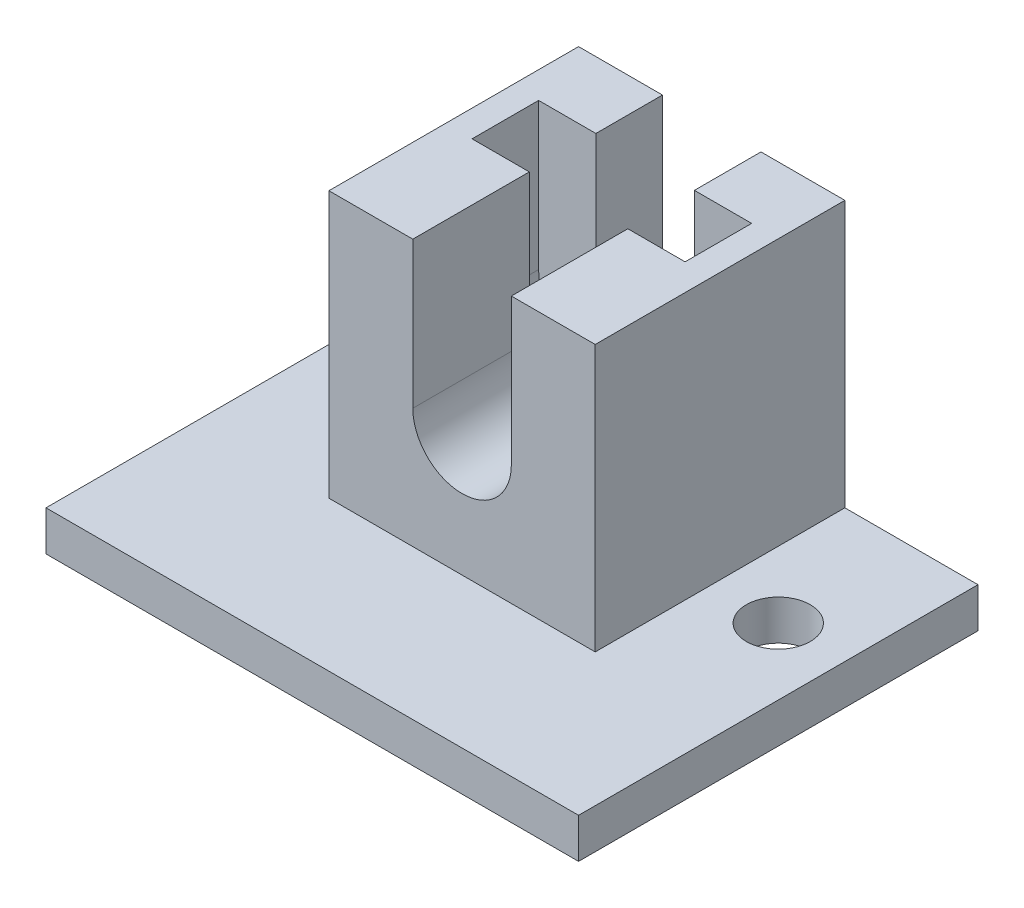
ISO-10303-21;
HEADER;
FILE_DESCRIPTION(('STEP AP214'),'2;1');
FILE_NAME('part.step','',(''),(''),'','','');
FILE_SCHEMA(('AUTOMOTIVE_DESIGN { 1 0 10303 214 1 1 1 1 }'));
ENDSEC;
DATA;
#1=APPLICATION_CONTEXT('core data for automotive mechanical design processes');
#2=APPLICATION_PROTOCOL_DEFINITION('international standard','automotive_design',2000,#1);
#3=PRODUCT_CONTEXT('',#1,'mechanical');
#4=PRODUCT('Part','Part','',(#3));
#5=PRODUCT_RELATED_PRODUCT_CATEGORY('part','',(#4));
#6=PRODUCT_DEFINITION_FORMATION('','',#4);
#7=PRODUCT_DEFINITION_CONTEXT('part definition',#1,'design');
#8=PRODUCT_DEFINITION('design','',#6,#7);
#9=PRODUCT_DEFINITION_SHAPE('','',#8);
#10=(LENGTH_UNIT() NAMED_UNIT(*) SI_UNIT(.MILLI.,.METRE.));
#11=(NAMED_UNIT(*) PLANE_ANGLE_UNIT() SI_UNIT($,.RADIAN.));
#12=(NAMED_UNIT(*) SI_UNIT($,.STERADIAN.) SOLID_ANGLE_UNIT());
#13=UNCERTAINTY_MEASURE_WITH_UNIT(LENGTH_MEASURE(1.E-05),#10,'distance_accuracy_value','');
#14=(GEOMETRIC_REPRESENTATION_CONTEXT(3) GLOBAL_UNCERTAINTY_ASSIGNED_CONTEXT((#13)) GLOBAL_UNIT_ASSIGNED_CONTEXT((#10,
#11,#12)) REPRESENTATION_CONTEXT('',''));
#15=CARTESIAN_POINT('',(0.,0.,0.));
#16=DIRECTION('',(0.,0.,1.));
#17=DIRECTION('',(1.,0.,0.));
#18=AXIS2_PLACEMENT_3D('',#15,#16,#17);
#19=CARTESIAN_POINT('',(0.,3.,-15.6296512348422));
#20=DIRECTION('',(0.,0.,-1.));
#21=DIRECTION('',(-1.,0.,0.));
#22=AXIS2_PLACEMENT_3D('',#19,#20,#21);
#23=PLANE('',#22);
#24=DIRECTION('',(-1.,0.,0.));
#25=VECTOR('',#24,1.);
#26=CARTESIAN_POINT('',(9.94835056024496,23.,-15.6296512348422));
#27=LINE('',#26,#25);
#28=CARTESIAN_POINT('',(-3.75164943975504,23.,-15.6296512348422));
#29=VERTEX_POINT('',#28);
#30=CARTESIAN_POINT('',(-10.051649439755,23.,-15.6296512348422));
#31=VERTEX_POINT('',#30);
#32=EDGE_CURVE('E238',#29,#31,#27,.T.);
#33=ORIENTED_EDGE('',*,*,#32,.F.);
#34=DIRECTION('',(0.,1.,0.));
#35=VECTOR('',#34,1.);
#36=CARTESIAN_POINT('',(-3.75164943975504,-0.001000000000001,-15.6296512348422));
#37=LINE('',#36,#35);
#38=CARTESIAN_POINT('',(-3.75164943975504,12.,-15.6296512348422));
#39=VERTEX_POINT('',#38);
#40=EDGE_CURVE('E198',#39,#29,#37,.T.);
#41=ORIENTED_EDGE('',*,*,#40,.F.);
#42=CARTESIAN_POINT('',(-0.051649439755044,12.,-15.6296512348422));
#43=DIRECTION('',(0.,0.,-1.));
#44=DIRECTION('',(-1.,0.,0.));
#45=AXIS2_PLACEMENT_3D('',#42,#43,#44);
#46=CIRCLE('',#45,3.7);
#47=CARTESIAN_POINT('',(3.64835056024496,12.,-15.6296512348422));
#48=VERTEX_POINT('',#47);
#49=EDGE_CURVE('E314',#48,#39,#46,.T.);
#50=ORIENTED_EDGE('',*,*,#49,.F.);
#51=DIRECTION('',(0.,1.,0.));
#52=VECTOR('',#51,1.);
#53=CARTESIAN_POINT('',(3.64835056024496,-0.001000000000001,-15.6296512348422));
#54=LINE('',#53,#52);
#55=CARTESIAN_POINT('',(3.64835056024496,23.,-15.6296512348422));
#56=VERTEX_POINT('',#55);
#57=EDGE_CURVE('E84',#48,#56,#54,.T.);
#58=ORIENTED_EDGE('',*,*,#57,.T.);
#59=CARTESIAN_POINT('',(9.94835056024496,23.,-15.6296512348422));
#60=VERTEX_POINT('',#59);
#61=EDGE_CURVE('E239',#60,#56,#27,.T.);
#62=ORIENTED_EDGE('',*,*,#61,.F.);
#63=DIRECTION('',(0.,-1.,0.));
#64=VECTOR('',#63,1.);
#65=CARTESIAN_POINT('',(9.94835056024496,20.,-15.6296512348422));
#66=LINE('',#65,#64);
#67=CARTESIAN_POINT('',(9.94835056024496,3.,-15.6296512348422));
#68=VERTEX_POINT('',#67);
#69=EDGE_CURVE('E280',#60,#68,#66,.T.);
#70=ORIENTED_EDGE('',*,*,#69,.T.);
#71=DIRECTION('',(1.,0.,0.));
#72=VECTOR('',#71,1.);
#73=CARTESIAN_POINT('',(0.,3.,-15.6296512348422));
#74=LINE('',#73,#72);
#75=CARTESIAN_POINT('',(19.948350560245,3.,-15.6296512348422));
#76=VERTEX_POINT('',#75);
#77=EDGE_CURVE('E290',#68,#76,#74,.T.);
#78=ORIENTED_EDGE('',*,*,#77,.T.);
#79=DIRECTION('',(0.,-1.,0.));
#80=VECTOR('',#79,1.);
#81=CARTESIAN_POINT('',(19.948350560245,3.,-15.6296512348422));
#82=LINE('',#81,#80);
#83=CARTESIAN_POINT('',(19.948350560245,0.,-15.6296512348422));
#84=VERTEX_POINT('',#83);
#85=EDGE_CURVE('E297',#76,#84,#82,.T.);
#86=ORIENTED_EDGE('',*,*,#85,.T.);
#87=DIRECTION('',(1.,0.,0.));
#88=VECTOR('',#87,1.);
#89=CARTESIAN_POINT('',(0.,0.,-15.6296512348422));
#90=LINE('',#89,#88);
#91=CARTESIAN_POINT('',(-20.051649439755,0.,-15.6296512348422));
#92=VERTEX_POINT('',#91);
#93=EDGE_CURVE('E285',#92,#84,#90,.T.);
#94=ORIENTED_EDGE('',*,*,#93,.F.);
#95=DIRECTION('',(0.,-1.,0.));
#96=VECTOR('',#95,1.);
#97=CARTESIAN_POINT('',(-20.051649439755,3.,-15.6296512348422));
#98=LINE('',#97,#96);
#99=CARTESIAN_POINT('',(-20.051649439755,3.,-15.6296512348422));
#100=VERTEX_POINT('',#99);
#101=EDGE_CURVE('E12',#100,#92,#98,.T.);
#102=ORIENTED_EDGE('',*,*,#101,.F.);
#103=CARTESIAN_POINT('',(-10.051649439755,3.,-15.6296512348422));
#104=VERTEX_POINT('',#103);
#105=EDGE_CURVE('E286',#100,#104,#74,.T.);
#106=ORIENTED_EDGE('',*,*,#105,.T.);
#107=DIRECTION('',(0.,-1.,0.));
#108=VECTOR('',#107,1.);
#109=CARTESIAN_POINT('',(-10.051649439755,20.,-15.6296512348422));
#110=LINE('',#109,#108);
#111=EDGE_CURVE('E278',#31,#104,#110,.T.);
#112=ORIENTED_EDGE('',*,*,#111,.F.);
#113=EDGE_LOOP('',(#33,#41,#50,#58,#62,#70,#78,#86,#94,#102,#106,#112));
#114=FACE_BOUND('',#113,.T.);
#115=ADVANCED_FACE('F60',(#114),#23,.T.);
#116=CARTESIAN_POINT('',(0.,0.,-10.6296512348422));
#117=DIRECTION('',(0.,0.,-1.));
#118=DIRECTION('',(-1.,0.,0.));
#119=AXIS2_PLACEMENT_3D('',#116,#117,#118);
#120=PLANE('',#119);
#121=DIRECTION('',(0.,1.,0.));
#122=VECTOR('',#121,1.);
#123=CARTESIAN_POINT('',(-3.75164943975504,-0.001000000000001,-10.6296512348422));
#124=LINE('',#123,#122);
#125=CARTESIAN_POINT('',(-3.75164943975504,12.,-10.6296512348422));
#126=VERTEX_POINT('',#125);
#127=CARTESIAN_POINT('',(-3.75164943975504,23.,-10.6296512348422));
#128=VERTEX_POINT('',#127);
#129=EDGE_CURVE('E76',#126,#128,#124,.T.);
#130=ORIENTED_EDGE('',*,*,#129,.T.);
#131=DIRECTION('',(-1.,0.,0.));
#132=VECTOR('',#131,1.);
#133=CARTESIAN_POINT('',(7.94835056024496,23.,-10.6296512348422));
#134=LINE('',#133,#132);
#135=CARTESIAN_POINT('',(-8.05164943975504,23.,-10.6296512348422));
#136=VERTEX_POINT('',#135);
#137=EDGE_CURVE('E209',#128,#136,#134,.T.);
#138=ORIENTED_EDGE('',*,*,#137,.T.);
#139=DIRECTION('',(0.,-1.,0.));
#140=VECTOR('',#139,1.);
#141=CARTESIAN_POINT('',(-8.05164943975504,0.,-10.6296512348422));
#142=LINE('',#141,#140);
#143=CARTESIAN_POINT('',(-8.05164943975504,12.,-10.6296512348422));
#144=VERTEX_POINT('',#143);
#145=EDGE_CURVE('E254',#136,#144,#142,.T.);
#146=ORIENTED_EDGE('',*,*,#145,.T.);
#147=CARTESIAN_POINT('',(-0.051649439755044,12.,-10.6296512348422));
#148=DIRECTION('',(0.,0.,-1.));
#149=DIRECTION('',(-1.,0.,0.));
#150=AXIS2_PLACEMENT_3D('',#147,#148,#149);
#151=CIRCLE('',#150,8.);
#152=CARTESIAN_POINT('',(7.94835056024496,12.,-10.6296512348422));
#153=VERTEX_POINT('',#152);
#154=EDGE_CURVE('E261',#153,#144,#151,.T.);
#155=ORIENTED_EDGE('',*,*,#154,.F.);
#156=DIRECTION('',(0.,1.,0.));
#157=VECTOR('',#156,1.);
#158=CARTESIAN_POINT('',(7.94835056024496,0.,-10.6296512348422));
#159=LINE('',#158,#157);
#160=CARTESIAN_POINT('',(7.94835056024496,23.,-10.6296512348422));
#161=VERTEX_POINT('',#160);
#162=EDGE_CURVE('E249',#153,#161,#159,.T.);
#163=ORIENTED_EDGE('',*,*,#162,.T.);
#164=CARTESIAN_POINT('',(3.64835056024496,23.,-10.6296512348422));
#165=VERTEX_POINT('',#164);
#166=EDGE_CURVE('E221',#161,#165,#134,.T.);
#167=ORIENTED_EDGE('',*,*,#166,.T.);
#168=DIRECTION('',(0.,1.,0.));
#169=VECTOR('',#168,1.);
#170=CARTESIAN_POINT('',(3.64835056024496,-0.001000000000001,-10.6296512348422));
#171=LINE('',#170,#169);
#172=CARTESIAN_POINT('',(3.64835056024496,12.,-10.6296512348422));
#173=VERTEX_POINT('',#172);
#174=EDGE_CURVE('E214',#173,#165,#171,.T.);
#175=ORIENTED_EDGE('',*,*,#174,.F.);
#176=CARTESIAN_POINT('',(-0.051649439755044,12.,-10.6296512348422));
#177=DIRECTION('',(0.,0.,-1.));
#178=DIRECTION('',(-1.,0.,0.));
#179=AXIS2_PLACEMENT_3D('',#176,#177,#178);
#180=CIRCLE('',#179,3.7);
#181=EDGE_CURVE('E213',#173,#126,#180,.T.);
#182=ORIENTED_EDGE('',*,*,#181,.T.);
#183=EDGE_LOOP('',(#130,#138,#146,#155,#163,#167,#175,#182));
#184=FACE_BOUND('',#183,.T.);
#185=ADVANCED_FACE('F207',(#184),#120,.F.);
#186=CARTESIAN_POINT('',(0.,23.,0.));
#187=DIRECTION('',(0.,1.,0.));
#188=DIRECTION('',(0.,0.,1.));
#189=AXIS2_PLACEMENT_3D('',#186,#187,#188);
#190=PLANE('',#189);
#191=ORIENTED_EDGE('',*,*,#137,.F.);
#192=DIRECTION('',(0.,0.,-1.));
#193=VECTOR('',#192,1.);
#194=CARTESIAN_POINT('',(-3.75164943975504,23.,0.));
#195=LINE('',#194,#193);
#196=EDGE_CURVE('E195',#128,#29,#195,.T.);
#197=ORIENTED_EDGE('',*,*,#196,.T.);
#198=ORIENTED_EDGE('',*,*,#32,.T.);
#199=DIRECTION('',(0.,0.,1.));
#200=VECTOR('',#199,1.);
#201=CARTESIAN_POINT('',(-10.051649439755,23.,-15.6296512348422));
#202=LINE('',#201,#200);
#203=CARTESIAN_POINT('',(-10.051649439755,23.,3.12034876515778));
#204=VERTEX_POINT('',#203);
#205=EDGE_CURVE('E242',#31,#204,#202,.T.);
#206=ORIENTED_EDGE('',*,*,#205,.T.);
#207=DIRECTION('',(1.,0.,0.));
#208=VECTOR('',#207,1.);
#209=CARTESIAN_POINT('',(-10.051649439755,23.,3.12034876515778));
#210=LINE('',#209,#208);
#211=CARTESIAN_POINT('',(-3.75164943975504,23.,3.12034876515778));
#212=VERTEX_POINT('',#211);
#213=EDGE_CURVE('E246',#204,#212,#210,.T.);
#214=ORIENTED_EDGE('',*,*,#213,.T.);
#215=DIRECTION('',(0.,0.,1.));
#216=VECTOR('',#215,1.);
#217=CARTESIAN_POINT('',(-3.75164943975504,23.,0.));
#218=LINE('',#217,#216);
#219=CARTESIAN_POINT('',(-3.75164943975504,23.,-5.62965123484221));
#220=VERTEX_POINT('',#219);
#221=EDGE_CURVE('E362',#220,#212,#218,.T.);
#222=ORIENTED_EDGE('',*,*,#221,.F.);
#223=DIRECTION('',(1.,0.,0.));
#224=VECTOR('',#223,1.);
#225=CARTESIAN_POINT('',(-8.05164943975504,23.,-5.62965123484221));
#226=LINE('',#225,#224);
#227=CARTESIAN_POINT('',(-8.05164943975504,23.,-5.62965123484221));
#228=VERTEX_POINT('',#227);
#229=EDGE_CURVE('E232',#228,#220,#226,.T.);
#230=ORIENTED_EDGE('',*,*,#229,.F.);
#231=DIRECTION('',(0.,0.,1.));
#232=VECTOR('',#231,1.);
#233=CARTESIAN_POINT('',(-8.05164943975504,23.,-10.6296512348422));
#234=LINE('',#233,#232);
#235=EDGE_CURVE('E220',#136,#228,#234,.T.);
#236=ORIENTED_EDGE('',*,*,#235,.F.);
#237=EDGE_LOOP('',(#191,#197,#198,#206,#214,#222,#230,#236));
#238=FACE_BOUND('',#237,.T.);
#239=ADVANCED_FACE('F217',(#238),#190,.T.);
#240=CARTESIAN_POINT('',(-0.051649439755044,12.,14.3703487651578));
#241=DIRECTION('',(0.,0.,-1.));
#242=DIRECTION('',(-1.,0.,0.));
#243=AXIS2_PLACEMENT_3D('',#240,#241,#242);
#244=CYLINDRICAL_SURFACE('',#243,3.7);
#245=DIRECTION('',(0.,0.,-1.));
#246=VECTOR('',#245,1.);
#247=CARTESIAN_POINT('',(3.64835056024496,12.,14.3703487651578));
#248=LINE('',#247,#246);
#249=CARTESIAN_POINT('',(3.64835056024496,12.,3.12034876515778));
#250=VERTEX_POINT('',#249);
#251=CARTESIAN_POINT('',(3.64835056024496,12.,-5.62965123484221));
#252=VERTEX_POINT('',#251);
#253=EDGE_CURVE('E348',#250,#252,#248,.T.);
#254=ORIENTED_EDGE('',*,*,#253,.T.);
#255=CARTESIAN_POINT('',(-0.051649439755044,12.,-5.62965123484221));
#256=DIRECTION('',(0.,0.,-1.));
#257=DIRECTION('',(-1.,0.,0.));
#258=AXIS2_PLACEMENT_3D('',#255,#256,#257);
#259=CIRCLE('',#258,3.7);
#260=CARTESIAN_POINT('',(-3.75164943975504,12.,-5.62965123484221));
#261=VERTEX_POINT('',#260);
#262=EDGE_CURVE('E313',#252,#261,#259,.T.);
#263=ORIENTED_EDGE('',*,*,#262,.T.);
#264=DIRECTION('',(0.,0.,-1.));
#265=VECTOR('',#264,1.);
#266=CARTESIAN_POINT('',(-3.75164943975504,12.,14.3703487651578));
#267=LINE('',#266,#265);
#268=CARTESIAN_POINT('',(-3.75164943975504,12.,3.12034876515778));
#269=VERTEX_POINT('',#268);
#270=EDGE_CURVE('E350',#269,#261,#267,.T.);
#271=ORIENTED_EDGE('',*,*,#270,.F.);
#272=CARTESIAN_POINT('',(-0.051649439755044,12.,3.12034876515778));
#273=DIRECTION('',(0.,0.,-1.));
#274=DIRECTION('',(-1.,0.,0.));
#275=AXIS2_PLACEMENT_3D('',#272,#273,#274);
#276=CIRCLE('',#275,3.7);
#277=EDGE_CURVE('E226',#250,#269,#276,.T.);
#278=ORIENTED_EDGE('',*,*,#277,.F.);
#279=EDGE_LOOP('',(#254,#263,#271,#278));
#280=FACE_BOUND('',#279,.T.);
#281=ADVANCED_FACE('F347',(#280),#244,.F.);
#282=CARTESIAN_POINT('',(-20.051649439755,3.,0.));
#283=DIRECTION('',(1.,0.,0.));
#284=DIRECTION('',(0.,0.,-1.));
#285=AXIS2_PLACEMENT_3D('',#282,#283,#284);
#286=PLANE('',#285);
#287=DIRECTION('',(0.,0.,1.));
#288=VECTOR('',#287,1.);
#289=CARTESIAN_POINT('',(-20.051649439755,0.,0.));
#290=LINE('',#289,#288);
#291=CARTESIAN_POINT('',(-20.051649439755,0.,14.3703487651578));
#292=VERTEX_POINT('',#291);
#293=EDGE_CURVE('E300',#92,#292,#290,.T.);
#294=ORIENTED_EDGE('',*,*,#293,.T.);
#295=DIRECTION('',(0.,-1.,0.));
#296=VECTOR('',#295,1.);
#297=CARTESIAN_POINT('',(-20.051649439755,3.,14.3703487651578));
#298=LINE('',#297,#296);
#299=CARTESIAN_POINT('',(-20.051649439755,3.,14.3703487651578));
#300=VERTEX_POINT('',#299);
#301=EDGE_CURVE('E68',#300,#292,#298,.T.);
#302=ORIENTED_EDGE('',*,*,#301,.F.);
#303=DIRECTION('',(0.,0.,1.));
#304=VECTOR('',#303,1.);
#305=CARTESIAN_POINT('',(-20.051649439755,3.,0.));
#306=LINE('',#305,#304);
#307=EDGE_CURVE('E289',#100,#300,#306,.T.);
#308=ORIENTED_EDGE('',*,*,#307,.F.);
#309=ORIENTED_EDGE('',*,*,#101,.T.);
#310=EDGE_LOOP('',(#294,#302,#308,#309));
#311=FACE_BOUND('',#310,.T.);
#312=ADVANCED_FACE('F448',(#311),#286,.F.);
#313=CARTESIAN_POINT('',(0.,3.,14.3703487651578));
#314=DIRECTION('',(0.,0.,-1.));
#315=DIRECTION('',(-1.,0.,0.));
#316=AXIS2_PLACEMENT_3D('',#313,#314,#315);
#317=PLANE('',#316);
#318=DIRECTION('',(1.,0.,0.));
#319=VECTOR('',#318,1.);
#320=CARTESIAN_POINT('',(0.,0.,14.3703487651578));
#321=LINE('',#320,#319);
#322=CARTESIAN_POINT('',(19.948350560245,0.,14.3703487651578));
#323=VERTEX_POINT('',#322);
#324=EDGE_CURVE('E302',#292,#323,#321,.T.);
#325=ORIENTED_EDGE('',*,*,#324,.T.);
#326=DIRECTION('',(0.,-1.,0.));
#327=VECTOR('',#326,1.);
#328=CARTESIAN_POINT('',(19.948350560245,3.,14.3703487651578));
#329=LINE('',#328,#327);
#330=CARTESIAN_POINT('',(19.948350560245,3.,14.3703487651578));
#331=VERTEX_POINT('',#330);
#332=EDGE_CURVE('E309',#331,#323,#329,.T.);
#333=ORIENTED_EDGE('',*,*,#332,.F.);
#334=DIRECTION('',(1.,0.,0.));
#335=VECTOR('',#334,1.);
#336=CARTESIAN_POINT('',(0.,3.,14.3703487651578));
#337=LINE('',#336,#335);
#338=EDGE_CURVE('E292',#300,#331,#337,.T.);
#339=ORIENTED_EDGE('',*,*,#338,.F.);
#340=ORIENTED_EDGE('',*,*,#301,.T.);
#341=EDGE_LOOP('',(#325,#333,#339,#340));
#342=FACE_BOUND('',#341,.T.);
#343=ADVANCED_FACE('F442',(#342),#317,.F.);
#344=CARTESIAN_POINT('',(19.948350560245,3.,0.));
#345=DIRECTION('',(1.,0.,0.));
#346=DIRECTION('',(0.,0.,-1.));
#347=AXIS2_PLACEMENT_3D('',#344,#345,#346);
#348=PLANE('',#347);
#349=DIRECTION('',(0.,0.,1.));
#350=VECTOR('',#349,1.);
#351=CARTESIAN_POINT('',(19.948350560245,0.,0.));
#352=LINE('',#351,#350);
#353=EDGE_CURVE('E305',#84,#323,#352,.T.);
#354=ORIENTED_EDGE('',*,*,#353,.F.);
#355=ORIENTED_EDGE('',*,*,#85,.F.);
#356=DIRECTION('',(0.,0.,1.));
#357=VECTOR('',#356,1.);
#358=CARTESIAN_POINT('',(19.948350560245,3.,0.));
#359=LINE('',#358,#357);
#360=EDGE_CURVE('E294',#76,#331,#359,.T.);
#361=ORIENTED_EDGE('',*,*,#360,.T.);
#362=ORIENTED_EDGE('',*,*,#332,.T.);
#363=EDGE_LOOP('',(#354,#355,#361,#362));
#364=FACE_BOUND('',#363,.T.);
#365=ADVANCED_FACE('F436',(#364),#348,.T.);
#366=CARTESIAN_POINT('',(0.,3.,0.));
#367=DIRECTION('',(0.,1.,0.));
#368=DIRECTION('',(0.,0.,1.));
#369=AXIS2_PLACEMENT_3D('',#366,#367,#368);
#370=PLANE('',#369);
#371=CARTESIAN_POINT('',(-15.051649439755,3.,-5.62965123484221));
#372=DIRECTION('',(0.,1.,0.));
#373=DIRECTION('',(0.,0.,1.));
#374=AXIS2_PLACEMENT_3D('',#371,#372,#373);
#375=CIRCLE('',#374,2.4);
#376=CARTESIAN_POINT('',(-15.051649439755,3.,-3.22965123484221));
#377=VERTEX_POINT('',#376);
#378=EDGE_CURVE('E317',#377,#377,#375,.T.);
#379=ORIENTED_EDGE('',*,*,#378,.F.);
#380=EDGE_LOOP('',(#379));
#381=FACE_BOUND('',#380,.T.);
#382=CARTESIAN_POINT('',(14.948350560245,3.,-5.62965123484221));
#383=DIRECTION('',(0.,1.,0.));
#384=DIRECTION('',(0.,0.,1.));
#385=AXIS2_PLACEMENT_3D('',#382,#383,#384);
#386=CIRCLE('',#385,2.4);
#387=CARTESIAN_POINT('',(14.948350560245,3.,-3.22965123484221));
#388=VERTEX_POINT('',#387);
#389=EDGE_CURVE('E322',#388,#388,#386,.T.);
#390=ORIENTED_EDGE('',*,*,#389,.F.);
#391=EDGE_LOOP('',(#390));
#392=FACE_BOUND('',#391,.T.);
#393=DIRECTION('',(0.,0.,1.));
#394=VECTOR('',#393,1.);
#395=CARTESIAN_POINT('',(-10.051649439755,3.,0.));
#396=LINE('',#395,#394);
#397=CARTESIAN_POINT('',(-10.051649439755,3.,3.12034876515778));
#398=VERTEX_POINT('',#397);
#399=EDGE_CURVE('E273',#104,#398,#396,.T.);
#400=ORIENTED_EDGE('',*,*,#399,.F.);
#401=ORIENTED_EDGE('',*,*,#105,.F.);
#402=ORIENTED_EDGE('',*,*,#307,.T.);
#403=ORIENTED_EDGE('',*,*,#338,.T.);
#404=ORIENTED_EDGE('',*,*,#360,.F.);
#405=ORIENTED_EDGE('',*,*,#77,.F.);
#406=DIRECTION('',(0.,0.,1.));
#407=VECTOR('',#406,1.);
#408=CARTESIAN_POINT('',(9.94835056024495,3.,0.));
#409=LINE('',#408,#407);
#410=CARTESIAN_POINT('',(9.94835056024495,3.,3.12034876515778));
#411=VERTEX_POINT('',#410);
#412=EDGE_CURVE('E270',#68,#411,#409,.T.);
#413=ORIENTED_EDGE('',*,*,#412,.T.);
#414=DIRECTION('',(1.,0.,0.));
#415=VECTOR('',#414,1.);
#416=CARTESIAN_POINT('',(0.,3.,3.12034876515778));
#417=LINE('',#416,#415);
#418=EDGE_CURVE('E267',#398,#411,#417,.T.);
#419=ORIENTED_EDGE('',*,*,#418,.F.);
#420=EDGE_LOOP('',(#400,#401,#402,#403,#404,#405,#413,#419));
#421=FACE_BOUND('',#420,.T.);
#422=ADVANCED_FACE('F423',(#381,#392,#421),#370,.T.);
#423=CARTESIAN_POINT('',(0.,0.,0.));
#424=DIRECTION('',(0.,1.,0.));
#425=DIRECTION('',(0.,0.,1.));
#426=AXIS2_PLACEMENT_3D('',#423,#424,#425);
#427=PLANE('',#426);
#428=CARTESIAN_POINT('',(-15.051649439755,0.,-5.62965123484221));
#429=DIRECTION('',(0.,1.,0.));
#430=DIRECTION('',(0.,0.,1.));
#431=AXIS2_PLACEMENT_3D('',#428,#429,#430);
#432=CIRCLE('',#431,2.4);
#433=CARTESIAN_POINT('',(-15.051649439755,0.,-3.22965123484221));
#434=VERTEX_POINT('',#433);
#435=EDGE_CURVE('E63',#434,#434,#432,.T.);
#436=ORIENTED_EDGE('',*,*,#435,.T.);
#437=EDGE_LOOP('',(#436));
#438=FACE_BOUND('',#437,.T.);
#439=CARTESIAN_POINT('',(14.948350560245,0.,-5.62965123484221));
#440=DIRECTION('',(0.,1.,0.));
#441=DIRECTION('',(0.,0.,1.));
#442=AXIS2_PLACEMENT_3D('',#439,#440,#441);
#443=CIRCLE('',#442,2.4);
#444=CARTESIAN_POINT('',(14.948350560245,0.,-3.22965123484221));
#445=VERTEX_POINT('',#444);
#446=EDGE_CURVE('E315',#445,#445,#443,.T.);
#447=ORIENTED_EDGE('',*,*,#446,.T.);
#448=EDGE_LOOP('',(#447));
#449=FACE_BOUND('',#448,.T.);
#450=ORIENTED_EDGE('',*,*,#93,.T.);
#451=ORIENTED_EDGE('',*,*,#353,.T.);
#452=ORIENTED_EDGE('',*,*,#324,.F.);
#453=ORIENTED_EDGE('',*,*,#293,.F.);
#454=EDGE_LOOP('',(#450,#451,#452,#453));
#455=FACE_BOUND('',#454,.T.);
#456=ADVANCED_FACE('F446',(#438,#449,#455),#427,.F.);
#457=CARTESIAN_POINT('',(0.,20.,3.12034876515778));
#458=DIRECTION('',(0.,0.,-1.));
#459=DIRECTION('',(-1.,0.,0.));
#460=AXIS2_PLACEMENT_3D('',#457,#458,#459);
#461=PLANE('',#460);
#462=CARTESIAN_POINT('',(3.64835056024496,23.,3.12034876515778));
#463=VERTEX_POINT('',#462);
#464=CARTESIAN_POINT('',(9.94835056024495,23.,3.12034876515778));
#465=VERTEX_POINT('',#464);
#466=EDGE_CURVE('E245',#463,#465,#210,.T.);
#467=ORIENTED_EDGE('',*,*,#466,.F.);
#468=DIRECTION('',(0.,1.,0.));
#469=VECTOR('',#468,1.);
#470=CARTESIAN_POINT('',(3.64835056024496,-0.001000000000001,3.12034876515778));
#471=LINE('',#470,#469);
#472=EDGE_CURVE('E329',#250,#463,#471,.T.);
#473=ORIENTED_EDGE('',*,*,#472,.F.);
#474=ORIENTED_EDGE('',*,*,#277,.T.);
#475=DIRECTION('',(0.,1.,0.));
#476=VECTOR('',#475,1.);
#477=CARTESIAN_POINT('',(-3.75164943975504,-0.001000000000001,3.12034876515778));
#478=LINE('',#477,#476);
#479=EDGE_CURVE('E343',#269,#212,#478,.T.);
#480=ORIENTED_EDGE('',*,*,#479,.T.);
#481=ORIENTED_EDGE('',*,*,#213,.F.);
#482=DIRECTION('',(0.,-1.,0.));
#483=VECTOR('',#482,1.);
#484=CARTESIAN_POINT('',(-10.051649439755,20.,3.12034876515778));
#485=LINE('',#484,#483);
#486=EDGE_CURVE('E275',#204,#398,#485,.T.);
#487=ORIENTED_EDGE('',*,*,#486,.T.);
#488=ORIENTED_EDGE('',*,*,#418,.T.);
#489=DIRECTION('',(0.,-1.,0.));
#490=VECTOR('',#489,1.);
#491=CARTESIAN_POINT('',(9.94835056024495,20.,3.12034876515778));
#492=LINE('',#491,#490);
#493=EDGE_CURVE('E282',#465,#411,#492,.T.);
#494=ORIENTED_EDGE('',*,*,#493,.F.);
#495=EDGE_LOOP('',(#467,#473,#474,#480,#481,#487,#488,#494));
#496=FACE_BOUND('',#495,.T.);
#497=ADVANCED_FACE('F341',(#496),#461,.F.);
#498=CARTESIAN_POINT('',(9.94835056024495,20.,0.));
#499=DIRECTION('',(1.,0.,0.));
#500=DIRECTION('',(0.,0.,-1.));
#501=AXIS2_PLACEMENT_3D('',#498,#499,#500);
#502=PLANE('',#501);
#503=ORIENTED_EDGE('',*,*,#412,.F.);
#504=ORIENTED_EDGE('',*,*,#69,.F.);
#505=DIRECTION('',(0.,0.,-1.));
#506=VECTOR('',#505,1.);
#507=CARTESIAN_POINT('',(9.94835056024495,23.,3.12034876515778));
#508=LINE('',#507,#506);
#509=EDGE_CURVE('E235',#465,#60,#508,.T.);
#510=ORIENTED_EDGE('',*,*,#509,.F.);
#511=ORIENTED_EDGE('',*,*,#493,.T.);
#512=EDGE_LOOP('',(#503,#504,#510,#511));
#513=FACE_BOUND('',#512,.T.);
#514=ADVANCED_FACE('F429',(#513),#502,.T.);
#515=CARTESIAN_POINT('',(-10.051649439755,20.,0.));
#516=DIRECTION('',(1.,0.,0.));
#517=DIRECTION('',(0.,0.,-1.));
#518=AXIS2_PLACEMENT_3D('',#515,#516,#517);
#519=PLANE('',#518);
#520=ORIENTED_EDGE('',*,*,#399,.T.);
#521=ORIENTED_EDGE('',*,*,#486,.F.);
#522=ORIENTED_EDGE('',*,*,#205,.F.);
#523=ORIENTED_EDGE('',*,*,#111,.T.);
#524=EDGE_LOOP('',(#520,#521,#522,#523));
#525=FACE_BOUND('',#524,.T.);
#526=ADVANCED_FACE('F469',(#525),#519,.F.);
#527=CARTESIAN_POINT('',(7.94835056024496,0.,-5.62965123484221));
#528=DIRECTION('',(-1.,0.,0.));
#529=DIRECTION('',(0.,0.,1.));
#530=AXIS2_PLACEMENT_3D('',#527,#528,#529);
#531=PLANE('',#530);
#532=ORIENTED_EDGE('',*,*,#162,.F.);
#533=DIRECTION('',(0.,0.,-1.));
#534=VECTOR('',#533,1.);
#535=CARTESIAN_POINT('',(7.94835056024496,12.,-5.62965123484221));
#536=LINE('',#535,#534);
#537=CARTESIAN_POINT('',(7.94835056024496,12.,-5.62965123484221));
#538=VERTEX_POINT('',#537);
#539=EDGE_CURVE('E259',#538,#153,#536,.T.);
#540=ORIENTED_EDGE('',*,*,#539,.F.);
#541=DIRECTION('',(0.,1.,0.));
#542=VECTOR('',#541,1.);
#543=CARTESIAN_POINT('',(7.94835056024496,0.,-5.62965123484221));
#544=LINE('',#543,#542);
#545=CARTESIAN_POINT('',(7.94835056024496,23.,-5.62965123484221));
#546=VERTEX_POINT('',#545);
#547=EDGE_CURVE('E250',#538,#546,#544,.T.);
#548=ORIENTED_EDGE('',*,*,#547,.T.);
#549=DIRECTION('',(0.,0.,-1.));
#550=VECTOR('',#549,1.);
#551=CARTESIAN_POINT('',(7.94835056024496,23.,-5.62965123484221));
#552=LINE('',#551,#550);
#553=EDGE_CURVE('E222',#546,#161,#552,.T.);
#554=ORIENTED_EDGE('',*,*,#553,.T.);
#555=EDGE_LOOP('',(#532,#540,#548,#554));
#556=FACE_BOUND('',#555,.T.);
#557=ADVANCED_FACE('F379',(#556),#531,.T.);
#558=CARTESIAN_POINT('',(-8.05164943975504,0.,-5.62965123484221));
#559=DIRECTION('',(1.,0.,0.));
#560=DIRECTION('',(0.,0.,-1.));
#561=AXIS2_PLACEMENT_3D('',#558,#559,#560);
#562=PLANE('',#561);
#563=ORIENTED_EDGE('',*,*,#145,.F.);
#564=ORIENTED_EDGE('',*,*,#235,.T.);
#565=DIRECTION('',(0.,-1.,0.));
#566=VECTOR('',#565,1.);
#567=CARTESIAN_POINT('',(-8.05164943975504,0.,-5.62965123484221));
#568=LINE('',#567,#566);
#569=CARTESIAN_POINT('',(-8.05164943975504,12.,-5.62965123484221));
#570=VERTEX_POINT('',#569);
#571=EDGE_CURVE('E257',#228,#570,#568,.T.);
#572=ORIENTED_EDGE('',*,*,#571,.T.);
#573=DIRECTION('',(0.,0.,-1.));
#574=VECTOR('',#573,1.);
#575=CARTESIAN_POINT('',(-8.05164943975504,12.,-5.62965123484221));
#576=LINE('',#575,#574);
#577=EDGE_CURVE('E265',#570,#144,#576,.T.);
#578=ORIENTED_EDGE('',*,*,#577,.T.);
#579=EDGE_LOOP('',(#563,#564,#572,#578));
#580=FACE_BOUND('',#579,.T.);
#581=ADVANCED_FACE('F386',(#580),#562,.T.);
#582=CARTESIAN_POINT('',(-0.051649439755044,12.,-5.62965123484221));
#583=DIRECTION('',(0.,0.,-1.));
#584=DIRECTION('',(-1.,0.,0.));
#585=AXIS2_PLACEMENT_3D('',#582,#583,#584);
#586=CYLINDRICAL_SURFACE('',#585,8.);
#587=ORIENTED_EDGE('',*,*,#154,.T.);
#588=ORIENTED_EDGE('',*,*,#577,.F.);
#589=CARTESIAN_POINT('',(-0.051649439755044,12.,-5.62965123484221));
#590=DIRECTION('',(0.,0.,-1.));
#591=DIRECTION('',(-1.,0.,0.));
#592=AXIS2_PLACEMENT_3D('',#589,#590,#591);
#593=CIRCLE('',#592,8.);
#594=EDGE_CURVE('E253',#538,#570,#593,.T.);
#595=ORIENTED_EDGE('',*,*,#594,.F.);
#596=ORIENTED_EDGE('',*,*,#539,.T.);
#597=EDGE_LOOP('',(#587,#588,#595,#596));
#598=FACE_BOUND('',#597,.T.);
#599=ADVANCED_FACE('F384',(#598),#586,.F.);
#600=CARTESIAN_POINT('',(0.,0.,-5.62965123484221));
#601=DIRECTION('',(0.,0.,-1.));
#602=DIRECTION('',(-1.,0.,0.));
#603=AXIS2_PLACEMENT_3D('',#600,#601,#602);
#604=PLANE('',#603);
#605=DIRECTION('',(0.,1.,0.));
#606=VECTOR('',#605,1.);
#607=CARTESIAN_POINT('',(3.64835056024496,-0.001000000000001,-5.62965123484221));
#608=LINE('',#607,#606);
#609=CARTESIAN_POINT('',(3.64835056024496,23.,-5.62965123484221));
#610=VERTEX_POINT('',#609);
#611=EDGE_CURVE('E361',#252,#610,#608,.T.);
#612=ORIENTED_EDGE('',*,*,#611,.T.);
#613=EDGE_CURVE('E231',#610,#546,#226,.T.);
#614=ORIENTED_EDGE('',*,*,#613,.T.);
#615=ORIENTED_EDGE('',*,*,#547,.F.);
#616=ORIENTED_EDGE('',*,*,#594,.T.);
#617=ORIENTED_EDGE('',*,*,#571,.F.);
#618=ORIENTED_EDGE('',*,*,#229,.T.);
#619=DIRECTION('',(0.,1.,0.));
#620=VECTOR('',#619,1.);
#621=CARTESIAN_POINT('',(-3.75164943975504,-0.001000000000001,-5.62965123484221));
#622=LINE('',#621,#620);
#623=EDGE_CURVE('E364',#261,#220,#622,.T.);
#624=ORIENTED_EDGE('',*,*,#623,.F.);
#625=ORIENTED_EDGE('',*,*,#262,.F.);
#626=EDGE_LOOP('',(#612,#614,#615,#616,#617,#618,#624,#625));
#627=FACE_BOUND('',#626,.T.);
#628=ADVANCED_FACE('F368',(#627),#604,.T.);
#629=DIRECTION('',(0.,0.,-1.));
#630=VECTOR('',#629,1.);
#631=CARTESIAN_POINT('',(3.64835056024496,23.,0.));
#632=LINE('',#631,#630);
#633=EDGE_CURVE('E202',#165,#56,#632,.T.);
#634=ORIENTED_EDGE('',*,*,#633,.F.);
#635=ORIENTED_EDGE('',*,*,#166,.F.);
#636=ORIENTED_EDGE('',*,*,#553,.F.);
#637=ORIENTED_EDGE('',*,*,#613,.F.);
#638=DIRECTION('',(0.,0.,-1.));
#639=VECTOR('',#638,1.);
#640=CARTESIAN_POINT('',(3.64835056024496,23.,0.));
#641=LINE('',#640,#639);
#642=EDGE_CURVE('E358',#463,#610,#641,.T.);
#643=ORIENTED_EDGE('',*,*,#642,.F.);
#644=ORIENTED_EDGE('',*,*,#466,.T.);
#645=ORIENTED_EDGE('',*,*,#509,.T.);
#646=ORIENTED_EDGE('',*,*,#61,.T.);
#647=EDGE_LOOP('',(#634,#635,#636,#637,#643,#644,#645,#646));
#648=FACE_BOUND('',#647,.T.);
#649=ADVANCED_FACE('F375',(#648),#190,.T.);
#650=ORIENTED_EDGE('',*,*,#49,.T.);
#651=DIRECTION('',(0.,0.,-1.));
#652=VECTOR('',#651,1.);
#653=CARTESIAN_POINT('',(-3.75164943975504,12.,14.3703487651578));
#654=LINE('',#653,#652);
#655=EDGE_CURVE('E203',#126,#39,#654,.T.);
#656=ORIENTED_EDGE('',*,*,#655,.F.);
#657=ORIENTED_EDGE('',*,*,#181,.F.);
#658=DIRECTION('',(0.,0.,-1.));
#659=VECTOR('',#658,1.);
#660=CARTESIAN_POINT('',(3.64835056024496,12.,14.3703487651578));
#661=LINE('',#660,#659);
#662=EDGE_CURVE('E353',#173,#48,#661,.T.);
#663=ORIENTED_EDGE('',*,*,#662,.T.);
#664=EDGE_LOOP('',(#650,#656,#657,#663));
#665=FACE_BOUND('',#664,.T.);
#666=ADVANCED_FACE('F389',(#665),#244,.F.);
#667=CARTESIAN_POINT('',(14.948350560245,-3.,-5.62965123484221));
#668=DIRECTION('',(0.,1.,0.));
#669=DIRECTION('',(0.,0.,1.));
#670=AXIS2_PLACEMENT_3D('',#667,#668,#669);
#671=CYLINDRICAL_SURFACE('',#670,2.4);
#672=ORIENTED_EDGE('',*,*,#389,.T.);
#673=EDGE_LOOP('',(#672));
#674=FACE_BOUND('',#673,.T.);
#675=ORIENTED_EDGE('',*,*,#446,.F.);
#676=EDGE_LOOP('',(#675));
#677=FACE_BOUND('',#676,.T.);
#678=ADVANCED_FACE('F482',(#674,#677),#671,.F.);
#679=CARTESIAN_POINT('',(-15.051649439755,-3.,-5.62965123484221));
#680=DIRECTION('',(0.,1.,0.));
#681=DIRECTION('',(0.,0.,1.));
#682=AXIS2_PLACEMENT_3D('',#679,#680,#681);
#683=CYLINDRICAL_SURFACE('',#682,2.4);
#684=ORIENTED_EDGE('',*,*,#378,.T.);
#685=EDGE_LOOP('',(#684));
#686=FACE_BOUND('',#685,.T.);
#687=ORIENTED_EDGE('',*,*,#435,.F.);
#688=EDGE_LOOP('',(#687));
#689=FACE_BOUND('',#688,.T.);
#690=ADVANCED_FACE('F406',(#686,#689),#683,.F.);
#691=CARTESIAN_POINT('',(-3.75164943975504,-0.001000000000001,0.));
#692=DIRECTION('',(-1.,0.,0.));
#693=DIRECTION('',(0.,0.,1.));
#694=AXIS2_PLACEMENT_3D('',#691,#692,#693);
#695=PLANE('',#694);
#696=ORIENTED_EDGE('',*,*,#270,.T.);
#697=ORIENTED_EDGE('',*,*,#623,.T.);
#698=ORIENTED_EDGE('',*,*,#221,.T.);
#699=ORIENTED_EDGE('',*,*,#479,.F.);
#700=EDGE_LOOP('',(#696,#697,#698,#699));
#701=FACE_BOUND('',#700,.T.);
#702=ADVANCED_FACE('F399',(#701),#695,.F.);
#703=CARTESIAN_POINT('',(3.64835056024496,-0.001000000000001,0.));
#704=DIRECTION('',(1.,0.,0.));
#705=DIRECTION('',(0.,0.,-1.));
#706=AXIS2_PLACEMENT_3D('',#703,#704,#705);
#707=PLANE('',#706);
#708=ORIENTED_EDGE('',*,*,#472,.T.);
#709=ORIENTED_EDGE('',*,*,#642,.T.);
#710=ORIENTED_EDGE('',*,*,#611,.F.);
#711=ORIENTED_EDGE('',*,*,#253,.F.);
#712=EDGE_LOOP('',(#708,#709,#710,#711));
#713=FACE_BOUND('',#712,.T.);
#714=ADVANCED_FACE('F396',(#713),#707,.F.);
#715=CARTESIAN_POINT('',(3.64835056024496,-0.001000000000001,0.));
#716=DIRECTION('',(1.,0.,0.));
#717=DIRECTION('',(0.,0.,-1.));
#718=AXIS2_PLACEMENT_3D('',#715,#716,#717);
#719=PLANE('',#718);
#720=ORIENTED_EDGE('',*,*,#174,.T.);
#721=ORIENTED_EDGE('',*,*,#633,.T.);
#722=ORIENTED_EDGE('',*,*,#57,.F.);
#723=ORIENTED_EDGE('',*,*,#662,.F.);
#724=EDGE_LOOP('',(#720,#721,#722,#723));
#725=FACE_BOUND('',#724,.T.);
#726=ADVANCED_FACE('F398',(#725),#719,.F.);
#727=CARTESIAN_POINT('',(-3.75164943975504,-0.001000000000001,0.));
#728=DIRECTION('',(1.,0.,0.));
#729=DIRECTION('',(0.,0.,-1.));
#730=AXIS2_PLACEMENT_3D('',#727,#728,#729);
#731=PLANE('',#730);
#732=ORIENTED_EDGE('',*,*,#655,.T.);
#733=ORIENTED_EDGE('',*,*,#40,.T.);
#734=ORIENTED_EDGE('',*,*,#196,.F.);
#735=ORIENTED_EDGE('',*,*,#129,.F.);
#736=EDGE_LOOP('',(#732,#733,#734,#735));
#737=FACE_BOUND('',#736,.T.);
#738=ADVANCED_FACE('F196',(#737),#731,.T.);
#739=CLOSED_SHELL('',(#115,#185,#239,#281,#312,#343,#365,#422,#456,#497,#514,#526,#557,#581,
#599,#628,#649,#666,#678,#690,#702,#714,#726,#738));
#740=MANIFOLD_SOLID_BREP('B2',#739);
#741=ADVANCED_BREP_SHAPE_REPRESENTATION('',(#18,#740),#14);
#742=SHAPE_DEFINITION_REPRESENTATION(#9,#741);
ENDSEC;
END-ISO-10303-21;
